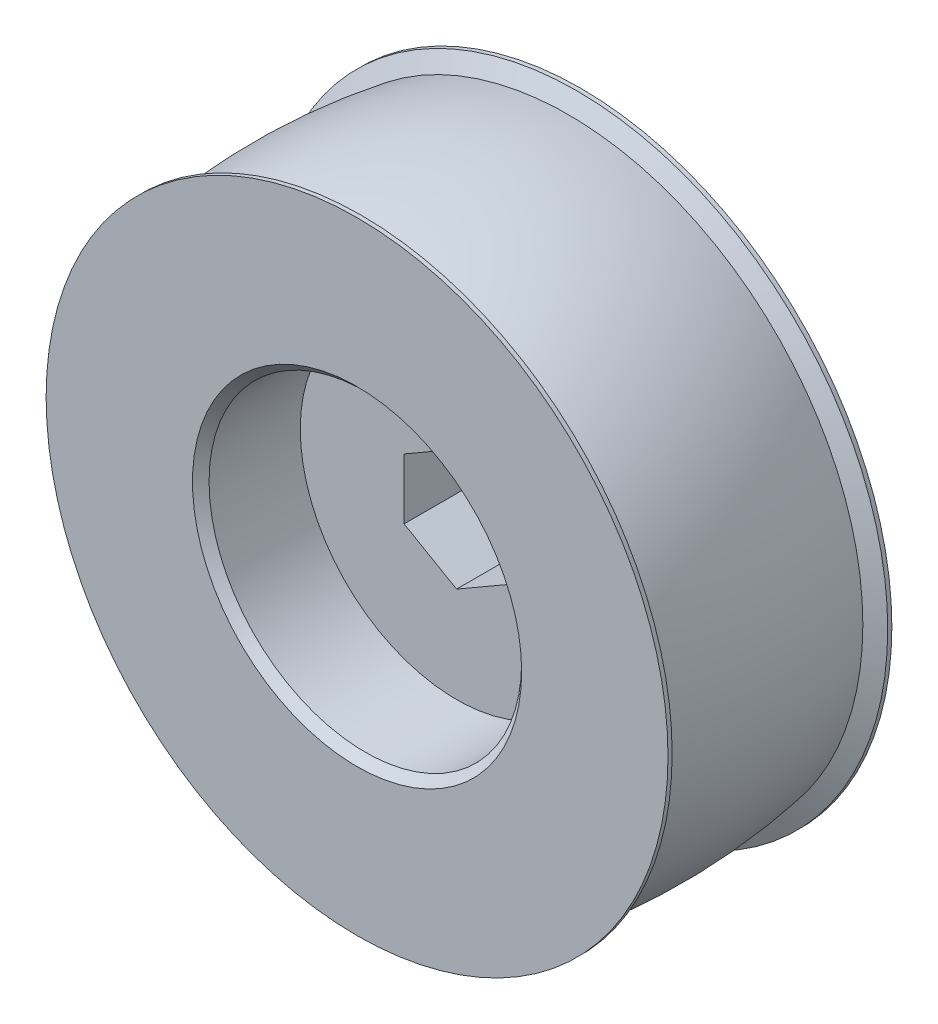
ISO-10303-21;
HEADER;
FILE_DESCRIPTION(('STEP AP214'),'2;1');
FILE_NAME('part.step','',(''),(''),'','','');
FILE_SCHEMA(('AUTOMOTIVE_DESIGN { 1 0 10303 214 1 1 1 1 }'));
ENDSEC;
DATA;
#1=APPLICATION_CONTEXT('core data for automotive mechanical design processes');
#2=APPLICATION_PROTOCOL_DEFINITION('international standard','automotive_design',2000,#1);
#3=PRODUCT_CONTEXT('',#1,'mechanical');
#4=PRODUCT('Part','Part','',(#3));
#5=PRODUCT_RELATED_PRODUCT_CATEGORY('part','',(#4));
#6=PRODUCT_DEFINITION_FORMATION('','',#4);
#7=PRODUCT_DEFINITION_CONTEXT('part definition',#1,'design');
#8=PRODUCT_DEFINITION('design','',#6,#7);
#9=PRODUCT_DEFINITION_SHAPE('','',#8);
#10=(LENGTH_UNIT() NAMED_UNIT(*) SI_UNIT(.MILLI.,.METRE.));
#11=(NAMED_UNIT(*) PLANE_ANGLE_UNIT() SI_UNIT($,.RADIAN.));
#12=(NAMED_UNIT(*) SI_UNIT($,.STERADIAN.) SOLID_ANGLE_UNIT());
#13=UNCERTAINTY_MEASURE_WITH_UNIT(LENGTH_MEASURE(1.E-05),#10,'distance_accuracy_value','');
#14=(GEOMETRIC_REPRESENTATION_CONTEXT(3) GLOBAL_UNCERTAINTY_ASSIGNED_CONTEXT((#13)) GLOBAL_UNIT_ASSIGNED_CONTEXT((#10,
#11,#12)) REPRESENTATION_CONTEXT('',''));
#15=CARTESIAN_POINT('',(0.,0.,0.));
#16=DIRECTION('',(0.,0.,1.));
#17=DIRECTION('',(1.,0.,0.));
#18=AXIS2_PLACEMENT_3D('',#15,#16,#17);
#19=CARTESIAN_POINT('',(0.,0.,15.));
#20=DIRECTION('',(0.,0.,-1.));
#21=DIRECTION('',(-1.,0.,0.));
#22=AXIS2_PLACEMENT_3D('',#19,#20,#21);
#23=CYLINDRICAL_SURFACE('',#22,37.5);
#24=CARTESIAN_POINT('',(0.,0.,26.5));
#25=DIRECTION('',(0.,0.,-1.));
#26=DIRECTION('',(-1.,0.,0.));
#27=AXIS2_PLACEMENT_3D('',#24,#25,#26);
#28=CIRCLE('',#27,37.5);
#29=CARTESIAN_POINT('',(-37.5,0.,26.5));
#30=VERTEX_POINT('',#29);
#31=EDGE_CURVE('E337',#30,#30,#28,.T.);
#32=ORIENTED_EDGE('',*,*,#31,.F.);
#33=EDGE_LOOP('',(#32));
#34=FACE_BOUND('',#33,.T.);
#35=CARTESIAN_POINT('',(0.,0.,27.));
#36=DIRECTION('',(0.,0.,1.));
#37=DIRECTION('',(1.,0.,0.));
#38=AXIS2_PLACEMENT_3D('',#35,#36,#37);
#39=CIRCLE('',#38,37.5);
#40=CARTESIAN_POINT('',(37.5,0.,27.));
#41=VERTEX_POINT('',#40);
#42=EDGE_CURVE('E139',#41,#41,#39,.T.);
#43=ORIENTED_EDGE('',*,*,#42,.F.);
#44=EDGE_LOOP('',(#43));
#45=FACE_BOUND('',#44,.T.);
#46=ADVANCED_FACE('F37',(#34,#45),#23,.T.);
#47=CARTESIAN_POINT('',(0.,0.,15.));
#48=DIRECTION('',(0.,0.,-1.));
#49=DIRECTION('',(-1.,0.,0.));
#50=AXIS2_PLACEMENT_3D('',#47,#48,#49);
#51=CYLINDRICAL_SURFACE('',#50,2.15);
#52=CARTESIAN_POINT('',(0.,0.,0.));
#53=DIRECTION('',(0.,0.,1.));
#54=DIRECTION('',(1.,0.,0.));
#55=AXIS2_PLACEMENT_3D('',#52,#53,#54);
#56=CIRCLE('',#55,2.15);
#57=CARTESIAN_POINT('',(2.15,0.,0.));
#58=VERTEX_POINT('',#57);
#59=EDGE_CURVE('E142',#58,#58,#56,.T.);
#60=ORIENTED_EDGE('',*,*,#59,.F.);
#61=EDGE_LOOP('',(#60));
#62=FACE_BOUND('',#61,.T.);
#63=CARTESIAN_POINT('',(0.,0.,2.));
#64=DIRECTION('',(0.,0.,1.));
#65=DIRECTION('',(1.,0.,0.));
#66=AXIS2_PLACEMENT_3D('',#63,#64,#65);
#67=CIRCLE('',#66,2.15);
#68=CARTESIAN_POINT('',(2.15,0.,2.));
#69=VERTEX_POINT('',#68);
#70=EDGE_CURVE('E138',#69,#69,#67,.T.);
#71=ORIENTED_EDGE('',*,*,#70,.T.);
#72=EDGE_LOOP('',(#71));
#73=FACE_BOUND('',#72,.T.);
#74=ADVANCED_FACE('F173',(#62,#73),#51,.F.);
#75=CARTESIAN_POINT('',(0.,0.,15.));
#76=DIRECTION('',(0.,0.,1.));
#77=DIRECTION('',(1.,0.,0.));
#78=AXIS2_PLACEMENT_3D('',#75,#76,#77);
#79=PLANE('',#78);
#80=DIRECTION('',(0.866025403784439,0.5,0.));
#81=VECTOR('',#80,1.);
#82=CARTESIAN_POINT('',(0.,-7.30348090524877,15.));
#83=LINE('',#82,#81);
#84=CARTESIAN_POINT('',(0.,-7.30348090524877,15.));
#85=VERTEX_POINT('',#84);
#86=CARTESIAN_POINT('',(6.325,-3.65174045262438,15.));
#87=VERTEX_POINT('',#86);
#88=EDGE_CURVE('E52',#85,#87,#83,.T.);
#89=ORIENTED_EDGE('',*,*,#88,.F.);
#90=DIRECTION('',(0.866025403784439,-0.5,0.));
#91=VECTOR('',#90,1.);
#92=CARTESIAN_POINT('',(-6.325,-3.65174045262438,15.));
#93=LINE('',#92,#91);
#94=CARTESIAN_POINT('',(-6.325,-3.65174045262438,15.));
#95=VERTEX_POINT('',#94);
#96=EDGE_CURVE('E126',#95,#85,#93,.T.);
#97=ORIENTED_EDGE('',*,*,#96,.F.);
#98=DIRECTION('',(0.,-1.,0.));
#99=VECTOR('',#98,1.);
#100=CARTESIAN_POINT('',(-6.325,3.65174045262439,15.));
#101=LINE('',#100,#99);
#102=CARTESIAN_POINT('',(-6.325,3.65174045262439,15.));
#103=VERTEX_POINT('',#102);
#104=EDGE_CURVE('E120',#103,#95,#101,.T.);
#105=ORIENTED_EDGE('',*,*,#104,.F.);
#106=DIRECTION('',(-0.866025403784439,-0.5,0.));
#107=VECTOR('',#106,1.);
#108=CARTESIAN_POINT('',(0.,7.30348090524877,15.));
#109=LINE('',#108,#107);
#110=CARTESIAN_POINT('',(0.,7.30348090524877,15.));
#111=VERTEX_POINT('',#110);
#112=EDGE_CURVE('E118',#111,#103,#109,.T.);
#113=ORIENTED_EDGE('',*,*,#112,.F.);
#114=DIRECTION('',(-0.866025403784439,0.5,0.));
#115=VECTOR('',#114,1.);
#116=CARTESIAN_POINT('',(6.325,3.65174045262439,15.));
#117=LINE('',#116,#115);
#118=CARTESIAN_POINT('',(6.325,3.65174045262439,15.));
#119=VERTEX_POINT('',#118);
#120=EDGE_CURVE('E103',#119,#111,#117,.T.);
#121=ORIENTED_EDGE('',*,*,#120,.F.);
#122=DIRECTION('',(0.,1.,0.));
#123=VECTOR('',#122,1.);
#124=CARTESIAN_POINT('',(6.325,-3.65174045262438,15.));
#125=LINE('',#124,#123);
#126=EDGE_CURVE('E110',#87,#119,#125,.T.);
#127=ORIENTED_EDGE('',*,*,#126,.F.);
#128=EDGE_LOOP('',(#89,#97,#105,#113,#121,#127));
#129=FACE_BOUND('',#128,.T.);
#130=CARTESIAN_POINT('',(0.,0.,15.));
#131=DIRECTION('',(0.,0.,1.));
#132=DIRECTION('',(1.,0.,0.));
#133=AXIS2_PLACEMENT_3D('',#130,#131,#132);
#134=CIRCLE('',#133,18.85);
#135=CARTESIAN_POINT('',(18.85,0.,15.));
#136=VERTEX_POINT('',#135);
#137=EDGE_CURVE('E148',#136,#136,#134,.F.);
#138=ORIENTED_EDGE('',*,*,#137,.F.);
#139=EDGE_LOOP('',(#138));
#140=FACE_BOUND('',#139,.T.);
#141=ADVANCED_FACE('F114',(#129,#140),#79,.T.);
#142=CARTESIAN_POINT('',(0.,0.,0.));
#143=DIRECTION('',(0.,0.,1.));
#144=DIRECTION('',(1.,0.,0.));
#145=AXIS2_PLACEMENT_3D('',#142,#143,#144);
#146=PLANE('',#145);
#147=CARTESIAN_POINT('',(0.,0.,0.));
#148=DIRECTION('',(0.,0.,1.));
#149=DIRECTION('',(1.,0.,0.));
#150=AXIS2_PLACEMENT_3D('',#147,#148,#149);
#151=CIRCLE('',#150,37.5);
#152=CARTESIAN_POINT('',(37.5,0.,0.));
#153=VERTEX_POINT('',#152);
#154=EDGE_CURVE('E145',#153,#153,#151,.T.);
#155=ORIENTED_EDGE('',*,*,#154,.F.);
#156=EDGE_LOOP('',(#155));
#157=FACE_BOUND('',#156,.T.);
#158=ORIENTED_EDGE('',*,*,#59,.T.);
#159=EDGE_LOOP('',(#158));
#160=FACE_BOUND('',#159,.T.);
#161=ADVANCED_FACE('F186',(#157,#160),#146,.F.);
#162=CARTESIAN_POINT('',(0.,0.,0.5));
#163=DIRECTION('',(0.,0.,-1.));
#164=DIRECTION('',(-1.,0.,0.));
#165=AXIS2_PLACEMENT_3D('',#162,#163,#164);
#166=CIRCLE('',#165,37.5);
#167=CARTESIAN_POINT('',(-37.5,0.,0.5));
#168=VERTEX_POINT('',#167);
#169=EDGE_CURVE('E198',#168,#168,#166,.T.);
#170=ORIENTED_EDGE('',*,*,#169,.T.);
#171=EDGE_LOOP('',(#170));
#172=FACE_BOUND('',#171,.T.);
#173=ORIENTED_EDGE('',*,*,#154,.T.);
#174=EDGE_LOOP('',(#173));
#175=FACE_BOUND('',#174,.T.);
#176=ADVANCED_FACE('F175',(#172,#175),#23,.T.);
#177=CARTESIAN_POINT('',(0.,0.,27.));
#178=DIRECTION('',(0.,0.,1.));
#179=DIRECTION('',(1.,0.,0.));
#180=AXIS2_PLACEMENT_3D('',#177,#178,#179);
#181=PLANE('',#180);
#182=CARTESIAN_POINT('',(0.,0.,27.));
#183=DIRECTION('',(0.,0.,1.));
#184=DIRECTION('',(1.,0.,0.));
#185=AXIS2_PLACEMENT_3D('',#182,#183,#184);
#186=CIRCLE('',#185,19.85);
#187=CARTESIAN_POINT('',(19.85,0.,27.));
#188=VERTEX_POINT('',#187);
#189=EDGE_CURVE('E12',#188,#188,#186,.F.);
#190=ORIENTED_EDGE('',*,*,#189,.T.);
#191=EDGE_LOOP('',(#190));
#192=FACE_BOUND('',#191,.T.);
#193=ORIENTED_EDGE('',*,*,#42,.T.);
#194=EDGE_LOOP('',(#193));
#195=FACE_BOUND('',#194,.T.);
#196=ADVANCED_FACE('F185',(#192,#195),#181,.T.);
#197=CARTESIAN_POINT('',(0.,0.,27.));
#198=DIRECTION('',(0.,0.,-1.));
#199=DIRECTION('',(-1.,0.,0.));
#200=AXIS2_PLACEMENT_3D('',#197,#198,#199);
#201=CYLINDRICAL_SURFACE('',#200,18.85);
#202=CARTESIAN_POINT('',(0.,0.,26.));
#203=DIRECTION('',(0.,0.,1.));
#204=DIRECTION('',(1.,0.,0.));
#205=AXIS2_PLACEMENT_3D('',#202,#203,#204);
#206=CIRCLE('',#205,18.85);
#207=CARTESIAN_POINT('',(18.85,0.,26.));
#208=VERTEX_POINT('',#207);
#209=EDGE_CURVE('E45',#208,#208,#206,.T.);
#210=ORIENTED_EDGE('',*,*,#209,.T.);
#211=EDGE_LOOP('',(#210));
#212=FACE_BOUND('',#211,.T.);
#213=ORIENTED_EDGE('',*,*,#137,.T.);
#214=EDGE_LOOP('',(#213));
#215=FACE_BOUND('',#214,.T.);
#216=ADVANCED_FACE('F155',(#212,#215),#201,.F.);
#217=CARTESIAN_POINT('',(0.,-7.30348090524877,-19.3231941803971));
#218=DIRECTION('',(0.5,-0.866025403784439,0.));
#219=DIRECTION('',(0.866025403784439,0.5,0.));
#220=AXIS2_PLACEMENT_3D('',#217,#218,#219);
#221=PLANE('',#220);
#222=DIRECTION('',(-0.866025403784439,-0.5,0.));
#223=VECTOR('',#222,1.);
#224=CARTESIAN_POINT('',(0.,-7.30348090524877,2.));
#225=LINE('',#224,#223);
#226=CARTESIAN_POINT('',(6.325,-3.65174045262438,2.));
#227=VERTEX_POINT('',#226);
#228=CARTESIAN_POINT('',(0.,-7.30348090524877,2.));
#229=VERTEX_POINT('',#228);
#230=EDGE_CURVE('E71',#227,#229,#225,.T.);
#231=ORIENTED_EDGE('',*,*,#230,.T.);
#232=DIRECTION('',(0.,0.,1.));
#233=VECTOR('',#232,1.);
#234=CARTESIAN_POINT('',(0.,-7.30348090524877,-19.3231941803971));
#235=LINE('',#234,#233);
#236=EDGE_CURVE('E129',#229,#85,#235,.T.);
#237=ORIENTED_EDGE('',*,*,#236,.T.);
#238=ORIENTED_EDGE('',*,*,#88,.T.);
#239=DIRECTION('',(0.,0.,1.));
#240=VECTOR('',#239,1.);
#241=CARTESIAN_POINT('',(6.325,-3.65174045262438,-19.3231941803971));
#242=LINE('',#241,#240);
#243=EDGE_CURVE('E107',#227,#87,#242,.T.);
#244=ORIENTED_EDGE('',*,*,#243,.F.);
#245=EDGE_LOOP('',(#231,#237,#238,#244));
#246=FACE_BOUND('',#245,.T.);
#247=ADVANCED_FACE('F209',(#246),#221,.F.);
#248=CARTESIAN_POINT('',(-6.325,-3.65174045262438,-19.3231941803971));
#249=DIRECTION('',(-0.5,-0.866025403784439,0.));
#250=DIRECTION('',(0.866025403784439,-0.5,0.));
#251=AXIS2_PLACEMENT_3D('',#248,#249,#250);
#252=PLANE('',#251);
#253=DIRECTION('',(-0.866025403784439,0.5,0.));
#254=VECTOR('',#253,1.);
#255=CARTESIAN_POINT('',(-6.325,-3.65174045262438,2.));
#256=LINE('',#255,#254);
#257=CARTESIAN_POINT('',(-6.325,-3.65174045262438,2.));
#258=VERTEX_POINT('',#257);
#259=EDGE_CURVE('E206',#229,#258,#256,.T.);
#260=ORIENTED_EDGE('',*,*,#259,.T.);
#261=DIRECTION('',(0.,0.,1.));
#262=VECTOR('',#261,1.);
#263=CARTESIAN_POINT('',(-6.325,-3.65174045262438,-19.3231941803971));
#264=LINE('',#263,#262);
#265=EDGE_CURVE('E131',#258,#95,#264,.T.);
#266=ORIENTED_EDGE('',*,*,#265,.T.);
#267=ORIENTED_EDGE('',*,*,#96,.T.);
#268=ORIENTED_EDGE('',*,*,#236,.F.);
#269=EDGE_LOOP('',(#260,#266,#267,#268));
#270=FACE_BOUND('',#269,.T.);
#271=ADVANCED_FACE('F211',(#270),#252,.F.);
#272=CARTESIAN_POINT('',(-6.325,3.65174045262439,-19.3231941803971));
#273=DIRECTION('',(-1.,0.,0.));
#274=DIRECTION('',(0.,-1.,0.));
#275=AXIS2_PLACEMENT_3D('',#272,#273,#274);
#276=PLANE('',#275);
#277=DIRECTION('',(0.,1.,0.));
#278=VECTOR('',#277,1.);
#279=CARTESIAN_POINT('',(-6.325,3.65174045262439,2.));
#280=LINE('',#279,#278);
#281=CARTESIAN_POINT('',(-6.325,3.65174045262439,2.));
#282=VERTEX_POINT('',#281);
#283=EDGE_CURVE('E342',#258,#282,#280,.T.);
#284=ORIENTED_EDGE('',*,*,#283,.T.);
#285=DIRECTION('',(0.,0.,1.));
#286=VECTOR('',#285,1.);
#287=CARTESIAN_POINT('',(-6.325,3.65174045262439,-19.3231941803971));
#288=LINE('',#287,#286);
#289=EDGE_CURVE('E133',#282,#103,#288,.T.);
#290=ORIENTED_EDGE('',*,*,#289,.T.);
#291=ORIENTED_EDGE('',*,*,#104,.T.);
#292=ORIENTED_EDGE('',*,*,#265,.F.);
#293=EDGE_LOOP('',(#284,#290,#291,#292));
#294=FACE_BOUND('',#293,.T.);
#295=ADVANCED_FACE('F217',(#294),#276,.F.);
#296=CARTESIAN_POINT('',(0.,7.30348090524877,-19.3231941803971));
#297=DIRECTION('',(-0.5,0.866025403784439,0.));
#298=DIRECTION('',(-0.866025403784439,-0.5,0.));
#299=AXIS2_PLACEMENT_3D('',#296,#297,#298);
#300=PLANE('',#299);
#301=DIRECTION('',(0.866025403784439,0.5,0.));
#302=VECTOR('',#301,1.);
#303=CARTESIAN_POINT('',(0.,7.30348090524877,2.));
#304=LINE('',#303,#302);
#305=CARTESIAN_POINT('',(0.,7.30348090524877,2.));
#306=VERTEX_POINT('',#305);
#307=EDGE_CURVE('E61',#282,#306,#304,.T.);
#308=ORIENTED_EDGE('',*,*,#307,.T.);
#309=DIRECTION('',(0.,0.,1.));
#310=VECTOR('',#309,1.);
#311=CARTESIAN_POINT('',(0.,7.30348090524877,-19.3231941803971));
#312=LINE('',#311,#310);
#313=EDGE_CURVE('E106',#306,#111,#312,.T.);
#314=ORIENTED_EDGE('',*,*,#313,.T.);
#315=ORIENTED_EDGE('',*,*,#112,.T.);
#316=ORIENTED_EDGE('',*,*,#289,.F.);
#317=EDGE_LOOP('',(#308,#314,#315,#316));
#318=FACE_BOUND('',#317,.T.);
#319=ADVANCED_FACE('F262',(#318),#300,.F.);
#320=CARTESIAN_POINT('',(6.325,3.65174045262439,-19.3231941803971));
#321=DIRECTION('',(0.5,0.866025403784439,0.));
#322=DIRECTION('',(-0.866025403784439,0.5,0.));
#323=AXIS2_PLACEMENT_3D('',#320,#321,#322);
#324=PLANE('',#323);
#325=DIRECTION('',(0.866025403784439,-0.5,0.));
#326=VECTOR('',#325,1.);
#327=CARTESIAN_POINT('',(6.325,3.65174045262439,2.));
#328=LINE('',#327,#326);
#329=CARTESIAN_POINT('',(6.325,3.65174045262439,2.));
#330=VERTEX_POINT('',#329);
#331=EDGE_CURVE('E105',#306,#330,#328,.T.);
#332=ORIENTED_EDGE('',*,*,#331,.T.);
#333=DIRECTION('',(0.,0.,1.));
#334=VECTOR('',#333,1.);
#335=CARTESIAN_POINT('',(6.325,3.65174045262439,-19.3231941803971));
#336=LINE('',#335,#334);
#337=EDGE_CURVE('E98',#330,#119,#336,.T.);
#338=ORIENTED_EDGE('',*,*,#337,.T.);
#339=ORIENTED_EDGE('',*,*,#120,.T.);
#340=ORIENTED_EDGE('',*,*,#313,.F.);
#341=EDGE_LOOP('',(#332,#338,#339,#340));
#342=FACE_BOUND('',#341,.T.);
#343=ADVANCED_FACE('F100',(#342),#324,.F.);
#344=CARTESIAN_POINT('',(6.325,-3.65174045262438,-19.3231941803971));
#345=DIRECTION('',(1.,0.,0.));
#346=DIRECTION('',(0.,1.,0.));
#347=AXIS2_PLACEMENT_3D('',#344,#345,#346);
#348=PLANE('',#347);
#349=DIRECTION('',(0.,-1.,0.));
#350=VECTOR('',#349,1.);
#351=CARTESIAN_POINT('',(6.325,-3.65174045262438,2.));
#352=LINE('',#351,#350);
#353=EDGE_CURVE('E80',#330,#227,#352,.T.);
#354=ORIENTED_EDGE('',*,*,#353,.T.);
#355=ORIENTED_EDGE('',*,*,#243,.T.);
#356=ORIENTED_EDGE('',*,*,#126,.T.);
#357=ORIENTED_EDGE('',*,*,#337,.F.);
#358=EDGE_LOOP('',(#354,#355,#356,#357));
#359=FACE_BOUND('',#358,.T.);
#360=ADVANCED_FACE('F111',(#359),#348,.F.);
#361=CARTESIAN_POINT('',(0.,0.,2.));
#362=DIRECTION('',(0.,0.,1.));
#363=DIRECTION('',(1.,0.,0.));
#364=AXIS2_PLACEMENT_3D('',#361,#362,#363);
#365=PLANE('',#364);
#366=ORIENTED_EDGE('',*,*,#70,.F.);
#367=EDGE_LOOP('',(#366));
#368=FACE_BOUND('',#367,.T.);
#369=ORIENTED_EDGE('',*,*,#230,.F.);
#370=ORIENTED_EDGE('',*,*,#353,.F.);
#371=ORIENTED_EDGE('',*,*,#331,.F.);
#372=ORIENTED_EDGE('',*,*,#307,.F.);
#373=ORIENTED_EDGE('',*,*,#283,.F.);
#374=ORIENTED_EDGE('',*,*,#259,.F.);
#375=EDGE_LOOP('',(#369,#370,#371,#372,#373,#374));
#376=FACE_BOUND('',#375,.T.);
#377=ADVANCED_FACE('F160',(#368,#376),#365,.T.);
#378=CARTESIAN_POINT('',(0.,0.,26.));
#379=DIRECTION('',(0.,0.,1.));
#380=DIRECTION('',(1.,0.,0.));
#381=AXIS2_PLACEMENT_3D('',#378,#379,#380);
#382=CONICAL_SURFACE('',#381,18.85,0.78539816339745);
#383=ORIENTED_EDGE('',*,*,#189,.F.);
#384=EDGE_LOOP('',(#383));
#385=FACE_BOUND('',#384,.T.);
#386=ORIENTED_EDGE('',*,*,#209,.F.);
#387=EDGE_LOOP('',(#386));
#388=FACE_BOUND('',#387,.T.);
#389=ADVANCED_FACE('F39',(#385,#388),#382,.F.);
#390=CARTESIAN_POINT('',(0.,0.,26.5));
#391=DIRECTION('',(0.,0.,1.));
#392=DIRECTION('',(1.,0.,0.));
#393=AXIS2_PLACEMENT_3D('',#390,#391,#392);
#394=CONICAL_SURFACE('',#393,37.5,1.10714871779409);
#395=CARTESIAN_POINT('',(0.,0.,25.5));
#396=DIRECTION('',(0.,0.,-1.));
#397=DIRECTION('',(-1.,0.,0.));
#398=AXIS2_PLACEMENT_3D('',#395,#396,#397);
#399=CIRCLE('',#398,35.5);
#400=CARTESIAN_POINT('',(-35.5,0.,25.5));
#401=VERTEX_POINT('',#400);
#402=EDGE_CURVE('E332',#401,#401,#399,.T.);
#403=ORIENTED_EDGE('',*,*,#402,.F.);
#404=EDGE_LOOP('',(#403));
#405=FACE_BOUND('',#404,.T.);
#406=ORIENTED_EDGE('',*,*,#31,.T.);
#407=EDGE_LOOP('',(#406));
#408=FACE_BOUND('',#407,.T.);
#409=ADVANCED_FACE('F159',(#405,#408),#394,.T.);
#410=CARTESIAN_POINT('',(0.,0.,1.5));
#411=DIRECTION('',(0.,0.,-1.));
#412=DIRECTION('',(-1.,0.,0.));
#413=AXIS2_PLACEMENT_3D('',#410,#411,#412);
#414=CONICAL_SURFACE('',#413,35.5,1.10714871779409);
#415=ORIENTED_EDGE('',*,*,#169,.F.);
#416=EDGE_LOOP('',(#415));
#417=FACE_BOUND('',#416,.T.);
#418=CARTESIAN_POINT('',(0.,0.,1.5));
#419=DIRECTION('',(0.,0.,-1.));
#420=DIRECTION('',(-1.,0.,0.));
#421=AXIS2_PLACEMENT_3D('',#418,#419,#420);
#422=CIRCLE('',#421,35.5);
#423=CARTESIAN_POINT('',(-35.5,0.,1.5));
#424=VERTEX_POINT('',#423);
#425=EDGE_CURVE('E329',#424,#424,#422,.T.);
#426=ORIENTED_EDGE('',*,*,#425,.T.);
#427=EDGE_LOOP('',(#426));
#428=FACE_BOUND('',#427,.T.);
#429=ADVANCED_FACE('F166',(#417,#428),#414,.T.);
#430=CARTESIAN_POINT('',(0.,0.,13.5));
#431=DIRECTION('',(0.,0.,-1.));
#432=DIRECTION('',(-1.,0.,0.));
#433=AXIS2_PLACEMENT_3D('',#430,#431,#432);
#434=DEGENERATE_TOROIDAL_SURFACE('',#433,35.9999999999999,72.4999999999999,.F.);
#435=ORIENTED_EDGE('',*,*,#425,.F.);
#436=EDGE_LOOP('',(#435));
#437=FACE_BOUND('',#436,.T.);
#438=ORIENTED_EDGE('',*,*,#402,.T.);
#439=EDGE_LOOP('',(#438));
#440=FACE_BOUND('',#439,.T.);
#441=ADVANCED_FACE('F312',(#437,#440),#434,.F.);
#442=CLOSED_SHELL('',(#46,#74,#141,#161,#176,#196,#216,#247,#271,#295,#319,#343,#360,#377,#389,
#409,#429,#441));
#443=MANIFOLD_SOLID_BREP('B2',#442);
#444=ADVANCED_BREP_SHAPE_REPRESENTATION('',(#18,#443),#14);
#445=SHAPE_DEFINITION_REPRESENTATION(#9,#444);
ENDSEC;
END-ISO-10303-21;
